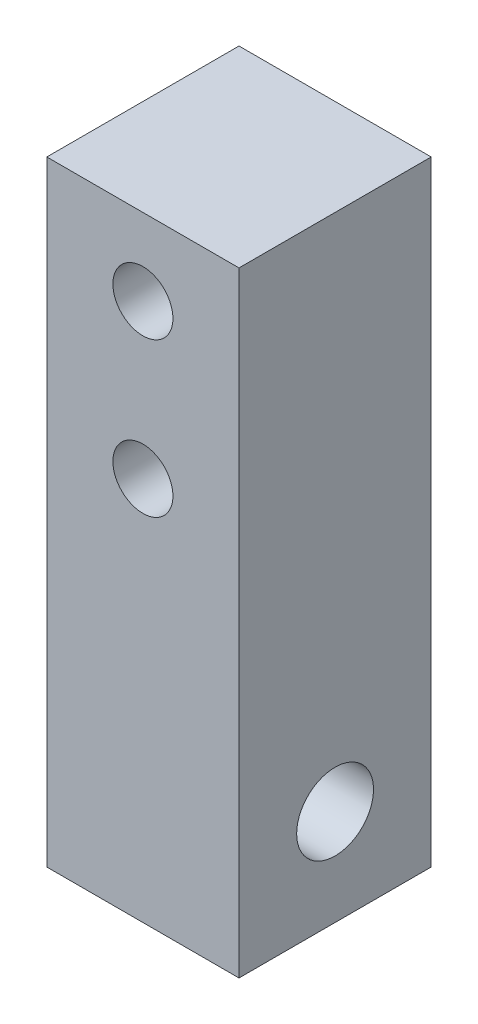
ISO-10303-21;
HEADER;
FILE_DESCRIPTION(('STEP AP214'),'2;1');
FILE_NAME('part.step','',(''),(''),'','','');
FILE_SCHEMA(('AUTOMOTIVE_DESIGN { 1 0 10303 214 1 1 1 1 }'));
ENDSEC;
DATA;
#1=APPLICATION_CONTEXT('core data for automotive mechanical design processes');
#2=APPLICATION_PROTOCOL_DEFINITION('international standard','automotive_design',2000,#1);
#3=PRODUCT_CONTEXT('',#1,'mechanical');
#4=PRODUCT('Part','Part','',(#3));
#5=PRODUCT_RELATED_PRODUCT_CATEGORY('part','',(#4));
#6=PRODUCT_DEFINITION_FORMATION('','',#4);
#7=PRODUCT_DEFINITION_CONTEXT('part definition',#1,'design');
#8=PRODUCT_DEFINITION('design','',#6,#7);
#9=PRODUCT_DEFINITION_SHAPE('','',#8);
#10=(LENGTH_UNIT() NAMED_UNIT(*) SI_UNIT(.MILLI.,.METRE.));
#11=(NAMED_UNIT(*) PLANE_ANGLE_UNIT() SI_UNIT($,.RADIAN.));
#12=(NAMED_UNIT(*) SI_UNIT($,.STERADIAN.) SOLID_ANGLE_UNIT());
#13=UNCERTAINTY_MEASURE_WITH_UNIT(LENGTH_MEASURE(1.E-05),#10,'distance_accuracy_value','');
#14=(GEOMETRIC_REPRESENTATION_CONTEXT(3) GLOBAL_UNCERTAINTY_ASSIGNED_CONTEXT((#13)) GLOBAL_UNIT_ASSIGNED_CONTEXT((#10,
#11,#12)) REPRESENTATION_CONTEXT('',''));
#15=CARTESIAN_POINT('',(0.,0.,0.));
#16=DIRECTION('',(0.,0.,1.));
#17=DIRECTION('',(1.,0.,0.));
#18=AXIS2_PLACEMENT_3D('',#15,#16,#17);
#19=CARTESIAN_POINT('',(0.,0.,31.75));
#20=DIRECTION('',(1.,0.,0.));
#21=DIRECTION('',(0.,0.,-1.));
#22=AXIS2_PLACEMENT_3D('',#19,#20,#21);
#23=PLANE('',#22);
#24=CARTESIAN_POINT('',(0.,15.875,15.875));
#25=DIRECTION('',(-1.,0.,0.));
#26=DIRECTION('',(0.,0.,1.));
#27=AXIS2_PLACEMENT_3D('',#24,#25,#26);
#28=CIRCLE('',#27,6.35);
#29=CARTESIAN_POINT('',(0.,15.875,22.225));
#30=VERTEX_POINT('',#29);
#31=EDGE_CURVE('E121',#30,#30,#28,.T.);
#32=ORIENTED_EDGE('',*,*,#31,.F.);
#33=EDGE_LOOP('',(#32));
#34=FACE_BOUND('',#33,.T.);
#35=DIRECTION('',(0.,-1.,0.));
#36=VECTOR('',#35,1.);
#37=CARTESIAN_POINT('',(0.,0.,0.));
#38=LINE('',#37,#36);
#39=CARTESIAN_POINT('',(0.,101.6,0.));
#40=VERTEX_POINT('',#39);
#41=CARTESIAN_POINT('',(0.,0.,0.));
#42=VERTEX_POINT('',#41);
#43=EDGE_CURVE('E95',#40,#42,#38,.T.);
#44=ORIENTED_EDGE('',*,*,#43,.T.);
#45=DIRECTION('',(0.,0.,-1.));
#46=VECTOR('',#45,1.);
#47=CARTESIAN_POINT('',(0.,0.,31.75));
#48=LINE('',#47,#46);
#49=CARTESIAN_POINT('',(0.,0.,31.75));
#50=VERTEX_POINT('',#49);
#51=EDGE_CURVE('E11',#50,#42,#48,.T.);
#52=ORIENTED_EDGE('',*,*,#51,.F.);
#53=DIRECTION('',(0.,-1.,0.));
#54=VECTOR('',#53,1.);
#55=CARTESIAN_POINT('',(0.,0.,31.75));
#56=LINE('',#55,#54);
#57=CARTESIAN_POINT('',(0.,101.6,31.75));
#58=VERTEX_POINT('',#57);
#59=EDGE_CURVE('E83',#58,#50,#56,.T.);
#60=ORIENTED_EDGE('',*,*,#59,.F.);
#61=DIRECTION('',(0.,0.,-1.));
#62=VECTOR('',#61,1.);
#63=CARTESIAN_POINT('',(0.,101.6,31.75));
#64=LINE('',#63,#62);
#65=EDGE_CURVE('E91',#58,#40,#64,.T.);
#66=ORIENTED_EDGE('',*,*,#65,.T.);
#67=EDGE_LOOP('',(#44,#52,#60,#66));
#68=FACE_BOUND('',#67,.T.);
#69=ADVANCED_FACE('F32',(#34,#68),#23,.F.);
#70=CARTESIAN_POINT('',(0.,0.,31.75));
#71=DIRECTION('',(0.,1.,0.));
#72=DIRECTION('',(0.,0.,1.));
#73=AXIS2_PLACEMENT_3D('',#70,#71,#72);
#74=PLANE('',#73);
#75=DIRECTION('',(1.,0.,0.));
#76=VECTOR('',#75,1.);
#77=CARTESIAN_POINT('',(0.,0.,0.));
#78=LINE('',#77,#76);
#79=CARTESIAN_POINT('',(31.75,0.,0.));
#80=VERTEX_POINT('',#79);
#81=EDGE_CURVE('E87',#42,#80,#78,.T.);
#82=ORIENTED_EDGE('',*,*,#81,.T.);
#83=DIRECTION('',(0.,0.,-1.));
#84=VECTOR('',#83,1.);
#85=CARTESIAN_POINT('',(31.75,0.,31.75));
#86=LINE('',#85,#84);
#87=CARTESIAN_POINT('',(31.75,0.,31.75));
#88=VERTEX_POINT('',#87);
#89=EDGE_CURVE('E40',#88,#80,#86,.T.);
#90=ORIENTED_EDGE('',*,*,#89,.F.);
#91=DIRECTION('',(1.,0.,0.));
#92=VECTOR('',#91,1.);
#93=CARTESIAN_POINT('',(0.,0.,31.75));
#94=LINE('',#93,#92);
#95=EDGE_CURVE('E78',#50,#88,#94,.T.);
#96=ORIENTED_EDGE('',*,*,#95,.F.);
#97=ORIENTED_EDGE('',*,*,#51,.T.);
#98=EDGE_LOOP('',(#82,#90,#96,#97));
#99=FACE_BOUND('',#98,.T.);
#100=ADVANCED_FACE('F86',(#99),#74,.F.);
#101=CARTESIAN_POINT('',(31.75,0.,31.75));
#102=DIRECTION('',(-1.,0.,0.));
#103=DIRECTION('',(0.,0.,1.));
#104=AXIS2_PLACEMENT_3D('',#101,#102,#103);
#105=PLANE('',#104);
#106=CARTESIAN_POINT('',(31.75,15.875,15.875));
#107=DIRECTION('',(-1.,0.,0.));
#108=DIRECTION('',(0.,0.,1.));
#109=AXIS2_PLACEMENT_3D('',#106,#107,#108);
#110=CIRCLE('',#109,6.35);
#111=CARTESIAN_POINT('',(31.75,15.875,22.225));
#112=VERTEX_POINT('',#111);
#113=EDGE_CURVE('E118',#112,#112,#110,.T.);
#114=ORIENTED_EDGE('',*,*,#113,.T.);
#115=EDGE_LOOP('',(#114));
#116=FACE_BOUND('',#115,.T.);
#117=DIRECTION('',(0.,1.,0.));
#118=VECTOR('',#117,1.);
#119=CARTESIAN_POINT('',(31.75,0.,0.));
#120=LINE('',#119,#118);
#121=CARTESIAN_POINT('',(31.75,101.6,0.));
#122=VERTEX_POINT('',#121);
#123=EDGE_CURVE('E65',#80,#122,#120,.T.);
#124=ORIENTED_EDGE('',*,*,#123,.T.);
#125=DIRECTION('',(0.,0.,-1.));
#126=VECTOR('',#125,1.);
#127=CARTESIAN_POINT('',(31.75,101.6,31.75));
#128=LINE('',#127,#126);
#129=CARTESIAN_POINT('',(31.75,101.6,31.75));
#130=VERTEX_POINT('',#129);
#131=EDGE_CURVE('E88',#130,#122,#128,.T.);
#132=ORIENTED_EDGE('',*,*,#131,.F.);
#133=DIRECTION('',(0.,1.,0.));
#134=VECTOR('',#133,1.);
#135=CARTESIAN_POINT('',(31.75,0.,31.75));
#136=LINE('',#135,#134);
#137=EDGE_CURVE('E81',#88,#130,#136,.T.);
#138=ORIENTED_EDGE('',*,*,#137,.F.);
#139=ORIENTED_EDGE('',*,*,#89,.T.);
#140=EDGE_LOOP('',(#124,#132,#138,#139));
#141=FACE_BOUND('',#140,.T.);
#142=ADVANCED_FACE('F89',(#116,#141),#105,.F.);
#143=CARTESIAN_POINT('',(0.,101.6,31.75));
#144=DIRECTION('',(0.,-1.,0.));
#145=DIRECTION('',(0.,0.,-1.));
#146=AXIS2_PLACEMENT_3D('',#143,#144,#145);
#147=PLANE('',#146);
#148=DIRECTION('',(-1.,0.,0.));
#149=VECTOR('',#148,1.);
#150=CARTESIAN_POINT('',(0.,101.6,0.));
#151=LINE('',#150,#149);
#152=EDGE_CURVE('E71',#122,#40,#151,.T.);
#153=ORIENTED_EDGE('',*,*,#152,.T.);
#154=ORIENTED_EDGE('',*,*,#65,.F.);
#155=DIRECTION('',(-1.,0.,0.));
#156=VECTOR('',#155,1.);
#157=CARTESIAN_POINT('',(0.,101.6,31.75));
#158=LINE('',#157,#156);
#159=EDGE_CURVE('E48',#130,#58,#158,.T.);
#160=ORIENTED_EDGE('',*,*,#159,.F.);
#161=ORIENTED_EDGE('',*,*,#131,.T.);
#162=EDGE_LOOP('',(#153,#154,#160,#161));
#163=FACE_BOUND('',#162,.T.);
#164=ADVANCED_FACE('F103',(#163),#147,.F.);
#165=CARTESIAN_POINT('',(0.,0.,31.75));
#166=DIRECTION('',(0.,0.,-1.));
#167=DIRECTION('',(-1.,0.,0.));
#168=AXIS2_PLACEMENT_3D('',#165,#166,#167);
#169=PLANE('',#168);
#170=CARTESIAN_POINT('',(15.875,63.5,31.75));
#171=DIRECTION('',(0.,0.,1.));
#172=DIRECTION('',(1.,0.,0.));
#173=AXIS2_PLACEMENT_3D('',#170,#171,#172);
#174=CIRCLE('',#173,4.9609375);
#175=CARTESIAN_POINT('',(20.8359375,63.5,31.75));
#176=VERTEX_POINT('',#175);
#177=EDGE_CURVE('E115',#176,#176,#174,.T.);
#178=ORIENTED_EDGE('',*,*,#177,.F.);
#179=EDGE_LOOP('',(#178));
#180=FACE_BOUND('',#179,.T.);
#181=CARTESIAN_POINT('',(15.875,88.9,31.75));
#182=DIRECTION('',(0.,0.,1.));
#183=DIRECTION('',(1.,0.,0.));
#184=AXIS2_PLACEMENT_3D('',#181,#182,#183);
#185=CIRCLE('',#184,4.9609375);
#186=CARTESIAN_POINT('',(20.8359375,88.9,31.75));
#187=VERTEX_POINT('',#186);
#188=EDGE_CURVE('E109',#187,#187,#185,.T.);
#189=ORIENTED_EDGE('',*,*,#188,.F.);
#190=EDGE_LOOP('',(#189));
#191=FACE_BOUND('',#190,.T.);
#192=ORIENTED_EDGE('',*,*,#59,.T.);
#193=ORIENTED_EDGE('',*,*,#95,.T.);
#194=ORIENTED_EDGE('',*,*,#137,.T.);
#195=ORIENTED_EDGE('',*,*,#159,.T.);
#196=EDGE_LOOP('',(#192,#193,#194,#195));
#197=FACE_BOUND('',#196,.T.);
#198=ADVANCED_FACE('F79',(#180,#191,#197),#169,.F.);
#199=CARTESIAN_POINT('',(0.,0.,0.));
#200=DIRECTION('',(0.,0.,-1.));
#201=DIRECTION('',(-1.,0.,0.));
#202=AXIS2_PLACEMENT_3D('',#199,#200,#201);
#203=PLANE('',#202);
#204=CARTESIAN_POINT('',(15.875,63.5,0.));
#205=DIRECTION('',(0.,0.,1.));
#206=DIRECTION('',(1.,0.,0.));
#207=AXIS2_PLACEMENT_3D('',#204,#205,#206);
#208=CIRCLE('',#207,4.9609375);
#209=CARTESIAN_POINT('',(20.8359375,63.5,0.));
#210=VERTEX_POINT('',#209);
#211=EDGE_CURVE('E112',#210,#210,#208,.T.);
#212=ORIENTED_EDGE('',*,*,#211,.T.);
#213=EDGE_LOOP('',(#212));
#214=FACE_BOUND('',#213,.T.);
#215=CARTESIAN_POINT('',(15.875,88.9,0.));
#216=DIRECTION('',(0.,0.,1.));
#217=DIRECTION('',(1.,0.,0.));
#218=AXIS2_PLACEMENT_3D('',#215,#216,#217);
#219=CIRCLE('',#218,4.9609375);
#220=CARTESIAN_POINT('',(20.8359375,88.9,0.));
#221=VERTEX_POINT('',#220);
#222=EDGE_CURVE('E98',#221,#221,#219,.T.);
#223=ORIENTED_EDGE('',*,*,#222,.T.);
#224=EDGE_LOOP('',(#223));
#225=FACE_BOUND('',#224,.T.);
#226=ORIENTED_EDGE('',*,*,#43,.F.);
#227=ORIENTED_EDGE('',*,*,#152,.F.);
#228=ORIENTED_EDGE('',*,*,#123,.F.);
#229=ORIENTED_EDGE('',*,*,#81,.F.);
#230=EDGE_LOOP('',(#226,#227,#228,#229));
#231=FACE_BOUND('',#230,.T.);
#232=ADVANCED_FACE('F106',(#214,#225,#231),#203,.T.);
#233=CARTESIAN_POINT('',(15.875,88.9,0.));
#234=DIRECTION('',(0.,0.,1.));
#235=DIRECTION('',(1.,0.,0.));
#236=AXIS2_PLACEMENT_3D('',#233,#234,#235);
#237=CYLINDRICAL_SURFACE('',#236,4.9609375);
#238=ORIENTED_EDGE('',*,*,#222,.F.);
#239=EDGE_LOOP('',(#238));
#240=FACE_BOUND('',#239,.T.);
#241=ORIENTED_EDGE('',*,*,#188,.T.);
#242=EDGE_LOOP('',(#241));
#243=FACE_BOUND('',#242,.T.);
#244=ADVANCED_FACE('F148',(#240,#243),#237,.F.);
#245=CARTESIAN_POINT('',(15.875,63.5,0.));
#246=DIRECTION('',(0.,0.,1.));
#247=DIRECTION('',(1.,0.,0.));
#248=AXIS2_PLACEMENT_3D('',#245,#246,#247);
#249=CYLINDRICAL_SURFACE('',#248,4.9609375);
#250=ORIENTED_EDGE('',*,*,#211,.F.);
#251=EDGE_LOOP('',(#250));
#252=FACE_BOUND('',#251,.T.);
#253=ORIENTED_EDGE('',*,*,#177,.T.);
#254=EDGE_LOOP('',(#253));
#255=FACE_BOUND('',#254,.T.);
#256=ADVANCED_FACE('F131',(#252,#255),#249,.F.);
#257=CARTESIAN_POINT('',(31.75,15.875,15.875));
#258=DIRECTION('',(-1.,0.,0.));
#259=DIRECTION('',(0.,0.,1.));
#260=AXIS2_PLACEMENT_3D('',#257,#258,#259);
#261=CYLINDRICAL_SURFACE('',#260,6.35);
#262=ORIENTED_EDGE('',*,*,#113,.F.);
#263=EDGE_LOOP('',(#262));
#264=FACE_BOUND('',#263,.T.);
#265=ORIENTED_EDGE('',*,*,#31,.T.);
#266=EDGE_LOOP('',(#265));
#267=FACE_BOUND('',#266,.T.);
#268=ADVANCED_FACE('F128',(#264,#267),#261,.F.);
#269=CLOSED_SHELL('',(#69,#100,#142,#164,#198,#232,#244,#256,#268));
#270=MANIFOLD_SOLID_BREP('B2',#269);
#271=ADVANCED_BREP_SHAPE_REPRESENTATION('',(#18,#270),#14);
#272=SHAPE_DEFINITION_REPRESENTATION(#9,#271);
ENDSEC;
END-ISO-10303-21;
